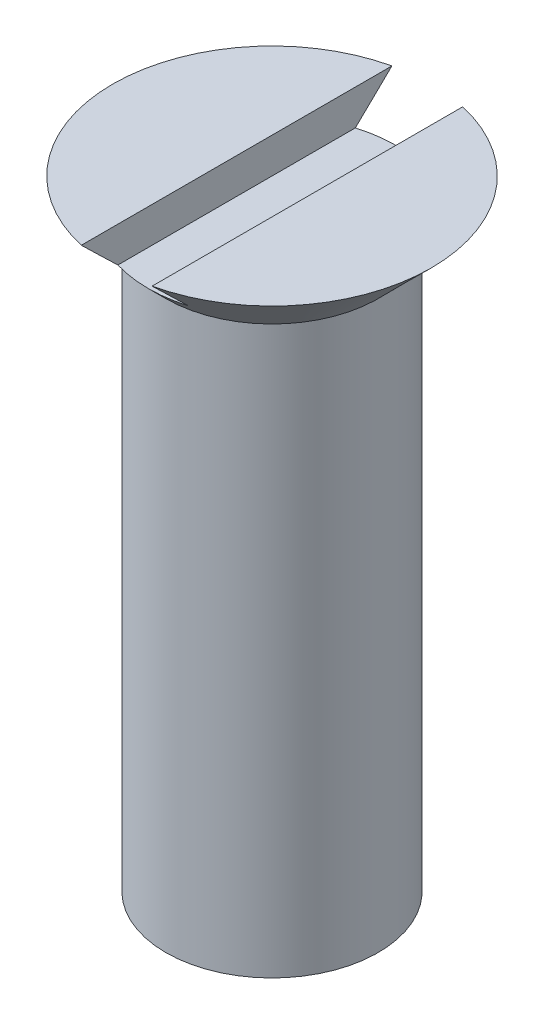
ISO-10303-21;
HEADER;
FILE_DESCRIPTION(('STEP AP214'),'2;1');
FILE_NAME('part.step','',(''),(''),'','','');
FILE_SCHEMA(('AUTOMOTIVE_DESIGN { 1 0 10303 214 1 1 1 1 }'));
ENDSEC;
DATA;
#1=APPLICATION_CONTEXT('core data for automotive mechanical design processes');
#2=APPLICATION_PROTOCOL_DEFINITION('international standard','automotive_design',2000,#1);
#3=PRODUCT_CONTEXT('',#1,'mechanical');
#4=PRODUCT('Part','Part','',(#3));
#5=PRODUCT_RELATED_PRODUCT_CATEGORY('part','',(#4));
#6=PRODUCT_DEFINITION_FORMATION('','',#4);
#7=PRODUCT_DEFINITION_CONTEXT('part definition',#1,'design');
#8=PRODUCT_DEFINITION('design','',#6,#7);
#9=PRODUCT_DEFINITION_SHAPE('','',#8);
#10=(LENGTH_UNIT() NAMED_UNIT(*) SI_UNIT(.MILLI.,.METRE.));
#11=(NAMED_UNIT(*) PLANE_ANGLE_UNIT() SI_UNIT($,.RADIAN.));
#12=(NAMED_UNIT(*) SI_UNIT($,.STERADIAN.) SOLID_ANGLE_UNIT());
#13=UNCERTAINTY_MEASURE_WITH_UNIT(LENGTH_MEASURE(1.E-05),#10,'distance_accuracy_value','');
#14=(GEOMETRIC_REPRESENTATION_CONTEXT(3) GLOBAL_UNCERTAINTY_ASSIGNED_CONTEXT((#13)) GLOBAL_UNIT_ASSIGNED_CONTEXT((#10,
#11,#12)) REPRESENTATION_CONTEXT('',''));
#15=CARTESIAN_POINT('',(0.,0.,0.));
#16=DIRECTION('',(0.,0.,1.));
#17=DIRECTION('',(1.,0.,0.));
#18=AXIS2_PLACEMENT_3D('',#15,#16,#17);
#19=CARTESIAN_POINT('',(0.,0.,0.));
#20=DIRECTION('',(0.,1.,0.));
#21=DIRECTION('',(0.,0.,1.));
#22=AXIS2_PLACEMENT_3D('',#19,#20,#21);
#23=PLANE('',#22);
#24=DIRECTION('',(0.,0.,1.));
#25=VECTOR('',#24,1.);
#26=CARTESIAN_POINT('',(-1.,0.,-4.89146939689396));
#27=LINE('',#26,#25);
#28=CARTESIAN_POINT('',(-1.,0.,-4.38748219369606));
#29=VERTEX_POINT('',#28);
#30=CARTESIAN_POINT('',(-1.,0.,4.38748219369606));
#31=VERTEX_POINT('',#30);
#32=EDGE_CURVE('E86',#29,#31,#27,.T.);
#33=ORIENTED_EDGE('',*,*,#32,.F.);
#34=CARTESIAN_POINT('',(0.,0.,0.));
#35=DIRECTION('',(0.,1.,0.));
#36=DIRECTION('',(0.,0.,1.));
#37=AXIS2_PLACEMENT_3D('',#34,#35,#36);
#38=CIRCLE('',#37,4.5);
#39=EDGE_CURVE('E93',#29,#31,#38,.T.);
#40=ORIENTED_EDGE('',*,*,#39,.T.);
#41=EDGE_LOOP('',(#33,#40));
#42=FACE_BOUND('',#41,.T.);
#43=ADVANCED_FACE('F38',(#42),#23,.T.);
#44=DIRECTION('',(0.,0.,-1.));
#45=VECTOR('',#44,1.);
#46=CARTESIAN_POINT('',(1.,0.,-4.89146939689396));
#47=LINE('',#46,#45);
#48=CARTESIAN_POINT('',(1.,0.,4.38748219369606));
#49=VERTEX_POINT('',#48);
#50=CARTESIAN_POINT('',(1.,0.,-4.38748219369606));
#51=VERTEX_POINT('',#50);
#52=EDGE_CURVE('E94',#49,#51,#47,.T.);
#53=ORIENTED_EDGE('',*,*,#52,.F.);
#54=EDGE_CURVE('E99',#49,#51,#38,.T.);
#55=ORIENTED_EDGE('',*,*,#54,.T.);
#56=EDGE_LOOP('',(#53,#55));
#57=FACE_BOUND('',#56,.T.);
#58=ADVANCED_FACE('F40',(#57),#23,.T.);
#59=CARTESIAN_POINT('',(0.,-17.5,0.));
#60=DIRECTION('',(0.,1.,0.));
#61=DIRECTION('',(0.,0.,1.));
#62=AXIS2_PLACEMENT_3D('',#59,#60,#61);
#63=CONICAL_SURFACE('',#62,3.,1.04719755119659);
#64=CARTESIAN_POINT('',(0.,-19.2320508075689,0.));
#65=VERTEX_POINT('',#64);
#66=VERTEX_LOOP('',#65);
#67=FACE_BOUND('',#66,.T.);
#68=CARTESIAN_POINT('',(0.,-17.5,0.));
#69=DIRECTION('',(0.,1.,0.));
#70=DIRECTION('',(0.,0.,1.));
#71=AXIS2_PLACEMENT_3D('',#68,#69,#70);
#72=CIRCLE('',#71,3.);
#73=CARTESIAN_POINT('',(0.,-17.5,3.));
#74=VERTEX_POINT('',#73);
#75=EDGE_CURVE('E110',#74,#74,#72,.T.);
#76=ORIENTED_EDGE('',*,*,#75,.F.);
#77=EDGE_LOOP('',(#76));
#78=FACE_BOUND('',#77,.T.);
#79=ADVANCED_FACE('F139',(#67,#78),#63,.T.);
#80=CARTESIAN_POINT('',(0.,0.,0.));
#81=DIRECTION('',(0.,1.,0.));
#82=DIRECTION('',(0.,0.,1.));
#83=AXIS2_PLACEMENT_3D('',#80,#81,#82);
#84=CYLINDRICAL_SURFACE('',#83,3.);
#85=ORIENTED_EDGE('',*,*,#75,.T.);
#86=EDGE_LOOP('',(#85));
#87=FACE_BOUND('',#86,.T.);
#88=CARTESIAN_POINT('',(0.,-1.50000000000002,0.));
#89=DIRECTION('',(0.,1.,0.));
#90=DIRECTION('',(0.,0.,1.));
#91=AXIS2_PLACEMENT_3D('',#88,#89,#90);
#92=CIRCLE('',#91,3.);
#93=CARTESIAN_POINT('',(0.,-1.50000000000002,3.));
#94=VERTEX_POINT('',#93);
#95=EDGE_CURVE('E103',#94,#94,#92,.T.);
#96=ORIENTED_EDGE('',*,*,#95,.F.);
#97=EDGE_LOOP('',(#96));
#98=FACE_BOUND('',#97,.T.);
#99=ADVANCED_FACE('F134',(#87,#98),#84,.T.);
#100=CARTESIAN_POINT('',(0.,0.,0.));
#101=DIRECTION('',(0.,1.,0.));
#102=DIRECTION('',(0.,0.,1.));
#103=AXIS2_PLACEMENT_3D('',#100,#101,#102);
#104=CONICAL_SURFACE('',#103,4.5,0.785398163397443);
#105=CARTESIAN_POINT('',(-0.999999999999999,5.43343108288245,9.88296782744809));
#106=CARTESIAN_POINT('',(-0.999999999999999,5.13814247191231,9.5861644769011));
#107=CARTESIAN_POINT('',(-0.999999999999999,4.8429148992186,9.28930034950636));
#108=CARTESIAN_POINT('',(-0.999999999999999,4.25260687790036,8.69535723416326));
#109=CARTESIAN_POINT('',(-0.999999999999999,3.95752645037907,8.39827822524221));
#110=CARTESIAN_POINT('',(-0.999999999999999,3.36674417022428,7.80301219615335));
#111=CARTESIAN_POINT('',(-0.999999999999999,3.07104302283231,7.50482447578739));
#112=CARTESIAN_POINT('',(-0.999999999999999,2.48002247095428,6.90813868306726));
#113=CARTESIAN_POINT('',(-0.999999999999999,2.18470302662586,6.60964065016918));
#114=CARTESIAN_POINT('',(-0.999999999999999,1.50218210248056,5.9186203078681));
#115=CARTESIAN_POINT('',(-1.,1.11516115181465,5.52591939712232));
#116=CARTESIAN_POINT('',(-1.,0.535757448375025,4.93560843708989));
#117=CARTESIAN_POINT('',(-1.,0.342772915600873,4.73858923554897));
#118=CARTESIAN_POINT('',(-1.,-0.0426019979849098,4.34398634056518));
#119=CARTESIAN_POINT('',(-1.,-0.234992403709271,4.146402671479));
#120=CARTESIAN_POINT('',(-1.,-0.618407669455784,3.75088106359369));
#121=CARTESIAN_POINT('',(-1.,-0.809434750882407,3.55294527908153));
#122=CARTESIAN_POINT('',(-1.,-1.19013417586722,3.15570847880046));
#123=CARTESIAN_POINT('',(-1.,-1.37980629618864,2.95640724820162));
#124=CARTESIAN_POINT('',(-1.,-1.66238991547897,2.65578069245973));
#125=CARTESIAN_POINT('',(-1.,-1.75623020013383,2.55532924938187));
#126=CARTESIAN_POINT('',(-1.,-1.94303723007565,2.35361827289211));
#127=CARTESIAN_POINT('',(-1.,-2.03600398944868,2.25235875255976));
#128=CARTESIAN_POINT('',(-1.,-2.22065361130653,2.04872217165194));
#129=CARTESIAN_POINT('',(-1.,-2.31233680141501,1.94634540857208));
#130=CARTESIAN_POINT('',(-1.,-2.49379439549236,1.73991767730372));
#131=CARTESIAN_POINT('',(-1.,-2.58356899953068,1.63586688662571));
#132=CARTESIAN_POINT('',(-1.,-2.70672748021879,1.48873658729301));
#133=CARTESIAN_POINT('',(-1.,-2.74143756930092,1.44676815228154));
#134=CARTESIAN_POINT('',(-1.,-2.81023416318456,1.3623185048658));
#135=CARTESIAN_POINT('',(-1.,-2.8443206364031,1.3198372666705));
#136=CARTESIAN_POINT('',(-1.,-2.91177341311139,1.2341646553514));
#137=CARTESIAN_POINT('',(-1.,-2.9451381058061,1.19097201047064));
#138=CARTESIAN_POINT('',(-1.,-3.01084327504167,1.10381542079932));
#139=CARTESIAN_POINT('',(-1.,-3.04318381254146,1.05985152215764));
#140=CARTESIAN_POINT('',(-1.,-3.10594235875921,0.971768984386917));
#141=CARTESIAN_POINT('',(-1.,-3.13638464892035,0.927667733320704));
#142=CARTESIAN_POINT('',(-1.,-3.19552732682965,0.838314629506005));
#143=CARTESIAN_POINT('',(-1.,-3.22422804487458,0.793062997256873));
#144=CARTESIAN_POINT('',(-1.,-3.2791756210606,0.701257336171294));
#145=CARTESIAN_POINT('',(-1.,-3.30542928296166,0.654707416299605));
#146=CARTESIAN_POINT('',(-1.,-3.35463661615791,0.559908407440614));
#147=CARTESIAN_POINT('',(-1.,-3.37759323484433,0.511660884679267));
#148=CARTESIAN_POINT('',(-1.,-3.41117115654154,0.431655560547803));
#149=CARTESIAN_POINT('',(-1.,-3.42319269997014,0.400487726010874));
#150=CARTESIAN_POINT('',(-1.,-3.44503697725531,0.337377241737213));
#151=CARTESIAN_POINT('',(-1.,-3.45485953036395,0.305434528547654));
#152=CARTESIAN_POINT('',(-1.,-3.47182865816489,0.241028563808717));
#153=CARTESIAN_POINT('',(-1.,-3.47899000576944,0.208569261724113));
#154=CARTESIAN_POINT('',(-1.,-3.49032153840369,0.143134598908808));
#155=CARTESIAN_POINT('',(-1.,-3.49449272090835,0.110159414023276));
#156=CARTESIAN_POINT('',(-1.,-3.49960642633556,0.0435882511731415));
#157=CARTESIAN_POINT('',(-1.,-3.50051283447754,0.00998943749732861));
#158=CARTESIAN_POINT('',(-1.,-3.49893178258733,-0.0571258373094146));
#159=CARTESIAN_POINT('',(-1.,-3.49644437025793,-0.0906422995912245));
#160=CARTESIAN_POINT('',(-1.,-3.48823331947185,-0.157398094755823));
#161=CARTESIAN_POINT('',(-1.,-3.48249745894227,-0.190635897121552));
#162=CARTESIAN_POINT('',(-1.,-3.46813240516246,-0.256485960661283));
#163=CARTESIAN_POINT('',(-1.,-3.45950167092178,-0.289097878870909));
#164=CARTESIAN_POINT('',(-1.,-3.43511616854976,-0.368812199833175));
#165=CARTESIAN_POINT('',(-1.,-3.41792268571304,-0.415472247556064));
#166=CARTESIAN_POINT('',(-1.,-3.37954251299083,-0.50711084391609));
#167=CARTESIAN_POINT('',(-1.,-3.35835290120806,-0.552088133129949));
#168=CARTESIAN_POINT('',(-1.,-3.31295524092567,-0.64072609852041));
#169=CARTESIAN_POINT('',(-1.,-3.28873417035779,-0.68438001926158));
#170=CARTESIAN_POINT('',(-1.,-3.23814197811062,-0.770385111696463));
#171=CARTESIAN_POINT('',(-1.,-3.21177172941897,-0.812736802817468));
#172=CARTESIAN_POINT('',(-1.,-3.15237683340008,-0.904164041277798));
#173=CARTESIAN_POINT('',(-1.,-3.11902623224324,-0.953026575603272));
#174=CARTESIAN_POINT('',(-1.,-3.05068959934191,-1.04959881929969));
#175=CARTESIAN_POINT('',(-1.,-3.01570324388988,-1.09730829762875));
#176=CARTESIAN_POINT('',(-1.,-2.9089047351552,-1.2391512804275));
#177=CARTESIAN_POINT('',(-1.,-2.83529977551564,-1.33193040723537));
#178=CARTESIAN_POINT('',(-1.,-2.68513338843045,-1.51541663627971));
#179=CARTESIAN_POINT('',(-1.,-2.6085650066108,-1.60611795580788));
#180=CARTESIAN_POINT('',(-1.,-2.45366691137891,-1.7859341474477));
#181=CARTESIAN_POINT('',(-1.,-2.37533794580038,-1.8750496653724));
#182=CARTESIAN_POINT('',(-1.,-2.21714308241661,-2.05257346539145));
#183=CARTESIAN_POINT('',(-1.,-2.13727211367551,-2.14097720916456));
#184=CARTESIAN_POINT('',(-1.,-1.9766624982502,-2.31700831981859));
#185=CARTESIAN_POINT('',(-1.,-1.89592376314919,-2.40463560589439));
#186=CARTESIAN_POINT('',(-1.,-1.73394638223087,-2.57916762686344));
#187=CARTESIAN_POINT('',(-1.,-1.65270873188922,-2.66607328702753));
#188=CARTESIAN_POINT('',(-1.,-1.48976305903713,-2.83943638242922));
#189=CARTESIAN_POINT('',(-1.,-1.40805505301086,-2.92589383317546));
#190=CARTESIAN_POINT('',(-1.,-1.18604313386781,-3.1598241602632));
#191=CARTESIAN_POINT('',(-1.,-1.04538978956241,-3.30696526366241));
#192=CARTESIAN_POINT('',(-1.,-0.763369654299911,-3.60056256734922));
#193=CARTESIAN_POINT('',(-1.,-0.622002859212139,-3.74701876366192));
#194=CARTESIAN_POINT('',(-1.,-0.197151468336845,-4.18567522777348));
#195=CARTESIAN_POINT('',(-1.,0.0870763774089059,-4.47715525369218));
#196=CARTESIAN_POINT('',(-1.,0.656822886718739,-5.05927870973759));
#197=CARTESIAN_POINT('',(-1.,0.942342361626139,-5.34992134387088));
#198=CARTESIAN_POINT('',(-1.,1.51404760448951,-5.93054278913641));
#199=CARTESIAN_POINT('',(-1.,1.80023336347064,-6.22052160910706));
#200=CARTESIAN_POINT('',(-1.,2.36509623415414,-6.79200718733028));
#201=CARTESIAN_POINT('',(-1.,2.64376137521529,-7.07352578472326));
#202=CARTESIAN_POINT('',(-1.,3.20138262603601,-7.63627708336224));
#203=CARTESIAN_POINT('',(-1.,3.48033873707227,-7.91750978334303));
#204=CARTESIAN_POINT('',(-1.,4.03822952192895,-8.47953560055715));
#205=CARTESIAN_POINT('',(-1.,4.31716402329072,-8.76032888901654));
#206=CARTESIAN_POINT('',(-1.,4.87519102231229,-9.3217556729389));
#207=CARTESIAN_POINT('',(-1.,5.15428351918305,-9.60238916918607));
#208=CARTESIAN_POINT('',(-1.,5.43343108288245,-9.88296782744809));
#209=B_SPLINE_CURVE_WITH_KNOTS('',3,(#105,#106,#107,#108,#109,#110,#111,#112,#113,#114,#115,
#116,#117,#118,#119,#120,#121,#122,#123,#124,#125,#126,#127,#128,#129,#130,#131,#132,#133,#134,
#135,#136,#137,#138,#139,#140,#141,#142,#143,#144,#145,#146,#147,#148,#149,#150,#151,#152,#153,
#154,#155,#156,#157,#158,#159,#160,#161,#162,#163,#164,#165,#166,#167,#168,#169,#170,#171,#172,
#173,#174,#175,#176,#177,#178,#179,#180,#181,#182,#183,#184,#185,#186,#187,#188,#189,#190,#191,
#192,#193,#194,#195,#196,#197,#198,#199,#200,#201,#202,#203,#204,#205,#206,#207,#208),
.UNSPECIFIED.,.F.,.F.,(4,2,2,2,2,2,2,2,2,2,2,2,2,2,2,2,2,2,2,2,2,2,2,2,2,2,2,2,2,2,2,2,2,2,2,2,
2,2,2,2,2,2,2,2,2,2,2,2,2,2,2,4),(0.,1.25602087065049,2.5121878139589,3.77202712608056,
5.03172214844253,6.68580268734144,7.51316910612837,8.34050034773606,9.16574255558566,
9.9911177278614,10.4035079821133,10.8158915748976,11.2281679162332,11.6404008250465,
11.8037831233945,11.967173673449,12.1308975011522,12.2946115654344,12.4553451771307,
12.6160482091008,12.7762901927675,12.9363880244092,13.0365402988845,13.1367008024432,
13.236296680116,13.3358593185936,13.436519988924,13.5371792444048,13.6382197639843,
13.7393141547356,13.8882269484484,14.0372490496459,14.1869348064441,14.3365600616526,
14.5139899325338,14.6914550657533,15.0466346469229,15.4027053661757,15.7586275953493,
16.1160437034019,16.4734965805188,16.8303827608546,17.1872565089213,17.797911763195,
18.4085705570397,19.6299218237036,20.8521935002396,22.0744488069469,23.2627931441083,
24.4511427175198,25.6385111450089,26.8258736941435),.UNSPECIFIED.);
#210=CARTESIAN_POINT('',(-1.,-1.,-3.3541019662497));
#211=VERTEX_POINT('',#210);
#212=EDGE_CURVE('E11',#211,#29,#209,.T.);
#213=ORIENTED_EDGE('',*,*,#212,.F.);
#214=CARTESIAN_POINT('',(0.,-1.,0.));
#215=DIRECTION('',(0.,1.,0.));
#216=DIRECTION('',(0.,0.,1.));
#217=AXIS2_PLACEMENT_3D('',#214,#215,#216);
#218=CIRCLE('',#217,3.50000000000001);
#219=CARTESIAN_POINT('',(1.,-1.,-3.3541019662497));
#220=VERTEX_POINT('',#219);
#221=EDGE_CURVE('E115',#211,#220,#218,.F.);
#222=ORIENTED_EDGE('',*,*,#221,.T.);
#223=CARTESIAN_POINT('',(0.999999999999999,5.43343108288245,-9.88296782744809));
#224=CARTESIAN_POINT('',(0.999999999999999,5.13814247191231,-9.5861644769011));
#225=CARTESIAN_POINT('',(0.999999999999999,4.8429148992186,-9.28930034950635));
#226=CARTESIAN_POINT('',(0.999999999999999,4.25260687790036,-8.69535723416325));
#227=CARTESIAN_POINT('',(0.999999999999999,3.95752645037907,-8.3982782252422));
#228=CARTESIAN_POINT('',(0.999999999999999,3.36674417022427,-7.80301219615334));
#229=CARTESIAN_POINT('',(0.999999999999999,3.0710430228323,-7.50482447578738));
#230=CARTESIAN_POINT('',(0.999999999999999,2.48002247095426,-6.90813868306725));
#231=CARTESIAN_POINT('',(0.999999999999999,2.18470302662584,-6.60964065016916));
#232=CARTESIAN_POINT('',(0.999999999999999,1.50218210248054,-5.91862030786809));
#233=CARTESIAN_POINT('',(1.,1.11516115181463,-5.5259193971223));
#234=CARTESIAN_POINT('',(1.,0.53575744837501,-4.93560843708988));
#235=CARTESIAN_POINT('',(1.,0.342772915600859,-4.73858923554895));
#236=CARTESIAN_POINT('',(1.,-0.042601997984922,-4.34398634056517));
#237=CARTESIAN_POINT('',(1.,-0.234992403709283,-4.14640267147899));
#238=CARTESIAN_POINT('',(1.,-0.618407669455794,-3.75088106359368));
#239=CARTESIAN_POINT('',(1.,-0.809434750882415,-3.55294527908152));
#240=CARTESIAN_POINT('',(1.,-1.19013417586723,-3.15570847880045));
#241=CARTESIAN_POINT('',(1.,-1.37980629618865,-2.95640724820161));
#242=CARTESIAN_POINT('',(1.,-1.66238991547897,-2.65578069245972));
#243=CARTESIAN_POINT('',(1.,-1.75623020013383,-2.55532924938186));
#244=CARTESIAN_POINT('',(1.,-1.94303723007565,-2.35361827289211));
#245=CARTESIAN_POINT('',(1.,-2.03600398944869,-2.25235875255975));
#246=CARTESIAN_POINT('',(1.,-2.22065361130654,-2.04872217165194));
#247=CARTESIAN_POINT('',(1.,-2.31233680141501,-1.94634540857208));
#248=CARTESIAN_POINT('',(1.,-2.49379439549236,-1.73991767730371));
#249=CARTESIAN_POINT('',(1.,-2.58356899953068,-1.63586688662571));
#250=CARTESIAN_POINT('',(1.,-2.70672748021879,-1.48873658729301));
#251=CARTESIAN_POINT('',(1.,-2.74143756930092,-1.44676815228154));
#252=CARTESIAN_POINT('',(1.,-2.81023416318456,-1.3623185048658));
#253=CARTESIAN_POINT('',(1.,-2.8443206364031,-1.3198372666705));
#254=CARTESIAN_POINT('',(1.,-2.91177341311139,-1.2341646553514));
#255=CARTESIAN_POINT('',(1.,-2.9451381058061,-1.19097201047064));
#256=CARTESIAN_POINT('',(1.,-3.01084327504167,-1.10381542079932));
#257=CARTESIAN_POINT('',(1.,-3.04318381254146,-1.05985152215765));
#258=CARTESIAN_POINT('',(1.,-3.10594235875921,-0.971768984386918));
#259=CARTESIAN_POINT('',(1.,-3.13638464892035,-0.927667733320705));
#260=CARTESIAN_POINT('',(1.,-3.19552732682965,-0.838314629506006));
#261=CARTESIAN_POINT('',(1.,-3.22422804487458,-0.793062997256874));
#262=CARTESIAN_POINT('',(1.,-3.2791756210606,-0.701257336171295));
#263=CARTESIAN_POINT('',(1.,-3.30542928296166,-0.654707416299606));
#264=CARTESIAN_POINT('',(1.,-3.35463661615791,-0.559908407440614));
#265=CARTESIAN_POINT('',(1.,-3.37759323484433,-0.511660884679267));
#266=CARTESIAN_POINT('',(1.,-3.41117115654154,-0.431655560547804));
#267=CARTESIAN_POINT('',(1.,-3.42319269997014,-0.400487726010875));
#268=CARTESIAN_POINT('',(1.,-3.44503697725531,-0.337377241737213));
#269=CARTESIAN_POINT('',(1.,-3.45485953036395,-0.305434528547654));
#270=CARTESIAN_POINT('',(1.,-3.47182865816489,-0.241028563808717));
#271=CARTESIAN_POINT('',(1.,-3.47899000576944,-0.208569261724112));
#272=CARTESIAN_POINT('',(1.,-3.49032153840369,-0.143134598908808));
#273=CARTESIAN_POINT('',(1.,-3.49449272090835,-0.110159414023275));
#274=CARTESIAN_POINT('',(1.,-3.49960642633556,-0.0435882511731414));
#275=CARTESIAN_POINT('',(1.,-3.50051283447754,-0.0099894374973286));
#276=CARTESIAN_POINT('',(1.,-3.49893178258733,0.0571258373094147));
#277=CARTESIAN_POINT('',(1.,-3.49644437025793,0.0906422995912246));
#278=CARTESIAN_POINT('',(1.,-3.48823331947185,0.157398094755823));
#279=CARTESIAN_POINT('',(1.,-3.48249745894227,0.190635897121552));
#280=CARTESIAN_POINT('',(1.,-3.46813240516246,0.256485960661283));
#281=CARTESIAN_POINT('',(1.,-3.45950167092178,0.289097878870909));
#282=CARTESIAN_POINT('',(1.,-3.43511616854976,0.368812199833175));
#283=CARTESIAN_POINT('',(1.,-3.41792268571304,0.415472247556064));
#284=CARTESIAN_POINT('',(1.,-3.37954251299083,0.50711084391609));
#285=CARTESIAN_POINT('',(1.,-3.35835290120806,0.552088133129949));
#286=CARTESIAN_POINT('',(1.,-3.31295524092567,0.64072609852041));
#287=CARTESIAN_POINT('',(1.,-3.28873417035779,0.684380019261581));
#288=CARTESIAN_POINT('',(1.,-3.23814197811062,0.770385111696464));
#289=CARTESIAN_POINT('',(1.,-3.21177172941897,0.812736802817468));
#290=CARTESIAN_POINT('',(1.,-3.15237683340008,0.904164041277798));
#291=CARTESIAN_POINT('',(1.,-3.11902623224324,0.953026575603272));
#292=CARTESIAN_POINT('',(1.,-3.05068959934191,1.04959881929969));
#293=CARTESIAN_POINT('',(1.,-3.01570324388988,1.09730829762875));
#294=CARTESIAN_POINT('',(1.,-2.9089047351552,1.2391512804275));
#295=CARTESIAN_POINT('',(1.,-2.83529977551564,1.33193040723537));
#296=CARTESIAN_POINT('',(1.,-2.68513338843045,1.51541663627971));
#297=CARTESIAN_POINT('',(1.,-2.6085650066108,1.60611795580788));
#298=CARTESIAN_POINT('',(1.,-2.45366691137891,1.7859341474477));
#299=CARTESIAN_POINT('',(1.,-2.37533794580038,1.8750496653724));
#300=CARTESIAN_POINT('',(1.,-2.21714308241661,2.05257346539145));
#301=CARTESIAN_POINT('',(1.,-2.13727211367551,2.14097720916456));
#302=CARTESIAN_POINT('',(1.,-1.9766624982502,2.31700831981859));
#303=CARTESIAN_POINT('',(1.,-1.89592376314919,2.40463560589439));
#304=CARTESIAN_POINT('',(1.,-1.73394638223087,2.57916762686344));
#305=CARTESIAN_POINT('',(1.,-1.65270873188922,2.66607328702753));
#306=CARTESIAN_POINT('',(1.,-1.48976305903713,2.83943638242922));
#307=CARTESIAN_POINT('',(1.,-1.40805505301086,2.92589383317546));
#308=CARTESIAN_POINT('',(1.,-1.18604313386781,3.1598241602632));
#309=CARTESIAN_POINT('',(1.,-1.04538978956241,3.30696526366241));
#310=CARTESIAN_POINT('',(1.,-0.76336965429991,3.60056256734922));
#311=CARTESIAN_POINT('',(1.,-0.622002859212137,3.74701876366192));
#312=CARTESIAN_POINT('',(1.,-0.197151468336842,4.18567522777348));
#313=CARTESIAN_POINT('',(1.,0.0870763774089091,4.47715525369218));
#314=CARTESIAN_POINT('',(1.,0.656822886718743,5.05927870973759));
#315=CARTESIAN_POINT('',(1.,0.942342361626143,5.34992134387088));
#316=CARTESIAN_POINT('',(1.,1.51404760448952,5.93054278913641));
#317=CARTESIAN_POINT('',(1.,1.80023336347064,6.22052160910706));
#318=CARTESIAN_POINT('',(1.,2.36509623415414,6.79200718733028));
#319=CARTESIAN_POINT('',(1.,2.6437613752153,7.07352578472326));
#320=CARTESIAN_POINT('',(1.,3.20138262603601,7.63627708336225));
#321=CARTESIAN_POINT('',(1.,3.48033873707227,7.91750978334303));
#322=CARTESIAN_POINT('',(1.,4.03822952192895,8.47953560055715));
#323=CARTESIAN_POINT('',(1.,4.31716402329072,8.76032888901654));
#324=CARTESIAN_POINT('',(1.,4.87519102231229,9.3217556729389));
#325=CARTESIAN_POINT('',(1.,5.15428351918305,9.60238916918607));
#326=CARTESIAN_POINT('',(1.,5.43343108288245,9.88296782744809));
#327=B_SPLINE_CURVE_WITH_KNOTS('',3,(#223,#224,#225,#226,#227,#228,#229,#230,#231,#232,#233,
#234,#235,#236,#237,#238,#239,#240,#241,#242,#243,#244,#245,#246,#247,#248,#249,#250,#251,#252,
#253,#254,#255,#256,#257,#258,#259,#260,#261,#262,#263,#264,#265,#266,#267,#268,#269,#270,#271,
#272,#273,#274,#275,#276,#277,#278,#279,#280,#281,#282,#283,#284,#285,#286,#287,#288,#289,#290,
#291,#292,#293,#294,#295,#296,#297,#298,#299,#300,#301,#302,#303,#304,#305,#306,#307,#308,#309,
#310,#311,#312,#313,#314,#315,#316,#317,#318,#319,#320,#321,#322,#323,#324,#325,#326),
.UNSPECIFIED.,.F.,.F.,(4,2,2,2,2,2,2,2,2,2,2,2,2,2,2,2,2,2,2,2,2,2,2,2,2,2,2,2,2,2,2,2,2,2,2,2,
2,2,2,2,2,2,2,2,2,2,2,2,2,2,2,4),(0.,1.2560208706505,2.51218781395891,3.77202712608058,
5.03172214844256,6.68580268734146,7.51316910612839,8.34050034773608,9.16574255558567,
9.9911177278614,10.4035079821133,10.8158915748976,11.2281679162332,11.6404008250465,
11.8037831233945,11.967173673449,12.1308975011522,12.2946115654344,12.4553451771307,
12.6160482091008,12.7762901927675,12.9363880244092,13.0365402988844,13.1367008024432,
13.236296680116,13.3358593185936,13.436519988924,13.5371792444048,13.6382197639843,
13.7393141547356,13.8882269484484,14.0372490496459,14.1869348064441,14.3365600616526,
14.5139899325338,14.6914550657533,15.0466346469229,15.4027053661757,15.7586275953493,
16.1160437034019,16.4734965805188,16.8303827608546,17.1872565089213,17.797911763195,
18.4085705570397,19.6299218237036,20.8521935002396,22.0744488069469,23.2627931441083,
24.4511427175198,25.6385111450089,26.8258736941435),.UNSPECIFIED.);
#328=EDGE_CURVE('E53',#51,#220,#327,.T.);
#329=ORIENTED_EDGE('',*,*,#328,.F.);
#330=ORIENTED_EDGE('',*,*,#54,.F.);
#331=CARTESIAN_POINT('',(1.,-1.,3.3541019662497));
#332=VERTEX_POINT('',#331);
#333=EDGE_CURVE('E114',#332,#49,#327,.T.);
#334=ORIENTED_EDGE('',*,*,#333,.F.);
#335=CARTESIAN_POINT('',(-1.,-1.,3.3541019662497));
#336=VERTEX_POINT('',#335);
#337=EDGE_CURVE('E113',#332,#336,#218,.F.);
#338=ORIENTED_EDGE('',*,*,#337,.T.);
#339=EDGE_CURVE('E42',#31,#336,#209,.T.);
#340=ORIENTED_EDGE('',*,*,#339,.F.);
#341=ORIENTED_EDGE('',*,*,#39,.F.);
#342=EDGE_LOOP('',(#213,#222,#329,#330,#334,#338,#340,#341));
#343=FACE_BOUND('',#342,.T.);
#344=ORIENTED_EDGE('',*,*,#95,.T.);
#345=EDGE_LOOP('',(#344));
#346=FACE_BOUND('',#345,.T.);
#347=ADVANCED_FACE('F96',(#343,#346),#104,.T.);
#348=CARTESIAN_POINT('',(-1.,-1.,-4.89146939689396));
#349=DIRECTION('',(-1.,0.,0.));
#350=DIRECTION('',(0.,0.,1.));
#351=AXIS2_PLACEMENT_3D('',#348,#349,#350);
#352=PLANE('',#351);
#353=ORIENTED_EDGE('',*,*,#339,.T.);
#354=DIRECTION('',(0.,0.,1.));
#355=VECTOR('',#354,1.);
#356=CARTESIAN_POINT('',(-1.,-1.,-4.89146939689396));
#357=LINE('',#356,#355);
#358=EDGE_CURVE('E60',#211,#336,#357,.T.);
#359=ORIENTED_EDGE('',*,*,#358,.F.);
#360=ORIENTED_EDGE('',*,*,#212,.T.);
#361=ORIENTED_EDGE('',*,*,#32,.T.);
#362=EDGE_LOOP('',(#353,#359,#360,#361));
#363=FACE_BOUND('',#362,.T.);
#364=ADVANCED_FACE('F85',(#363),#352,.F.);
#365=CARTESIAN_POINT('',(1.,-1.,-4.89146939689396));
#366=DIRECTION('',(1.,0.,0.));
#367=DIRECTION('',(0.,0.,-1.));
#368=AXIS2_PLACEMENT_3D('',#365,#366,#367);
#369=PLANE('',#368);
#370=ORIENTED_EDGE('',*,*,#328,.T.);
#371=DIRECTION('',(0.,0.,-1.));
#372=VECTOR('',#371,1.);
#373=CARTESIAN_POINT('',(1.,-1.,-4.89146939689396));
#374=LINE('',#373,#372);
#375=EDGE_CURVE('E100',#332,#220,#374,.T.);
#376=ORIENTED_EDGE('',*,*,#375,.F.);
#377=ORIENTED_EDGE('',*,*,#333,.T.);
#378=ORIENTED_EDGE('',*,*,#52,.T.);
#379=EDGE_LOOP('',(#370,#376,#377,#378));
#380=FACE_BOUND('',#379,.T.);
#381=ADVANCED_FACE('F123',(#380),#369,.F.);
#382=CARTESIAN_POINT('',(-1.,-1.,4.9061145148486));
#383=DIRECTION('',(0.,1.,0.));
#384=DIRECTION('',(0.,0.,1.));
#385=AXIS2_PLACEMENT_3D('',#382,#383,#384);
#386=PLANE('',#385);
#387=ORIENTED_EDGE('',*,*,#358,.T.);
#388=ORIENTED_EDGE('',*,*,#337,.F.);
#389=ORIENTED_EDGE('',*,*,#375,.T.);
#390=ORIENTED_EDGE('',*,*,#221,.F.);
#391=EDGE_LOOP('',(#387,#388,#389,#390));
#392=FACE_BOUND('',#391,.T.);
#393=ADVANCED_FACE('F127',(#392),#386,.T.);
#394=CLOSED_SHELL('',(#43,#58,#79,#99,#347,#364,#381,#393));
#395=MANIFOLD_SOLID_BREP('B2',#394);
#396=ADVANCED_BREP_SHAPE_REPRESENTATION('',(#18,#395),#14);
#397=SHAPE_DEFINITION_REPRESENTATION(#9,#396);
ENDSEC;
END-ISO-10303-21;
